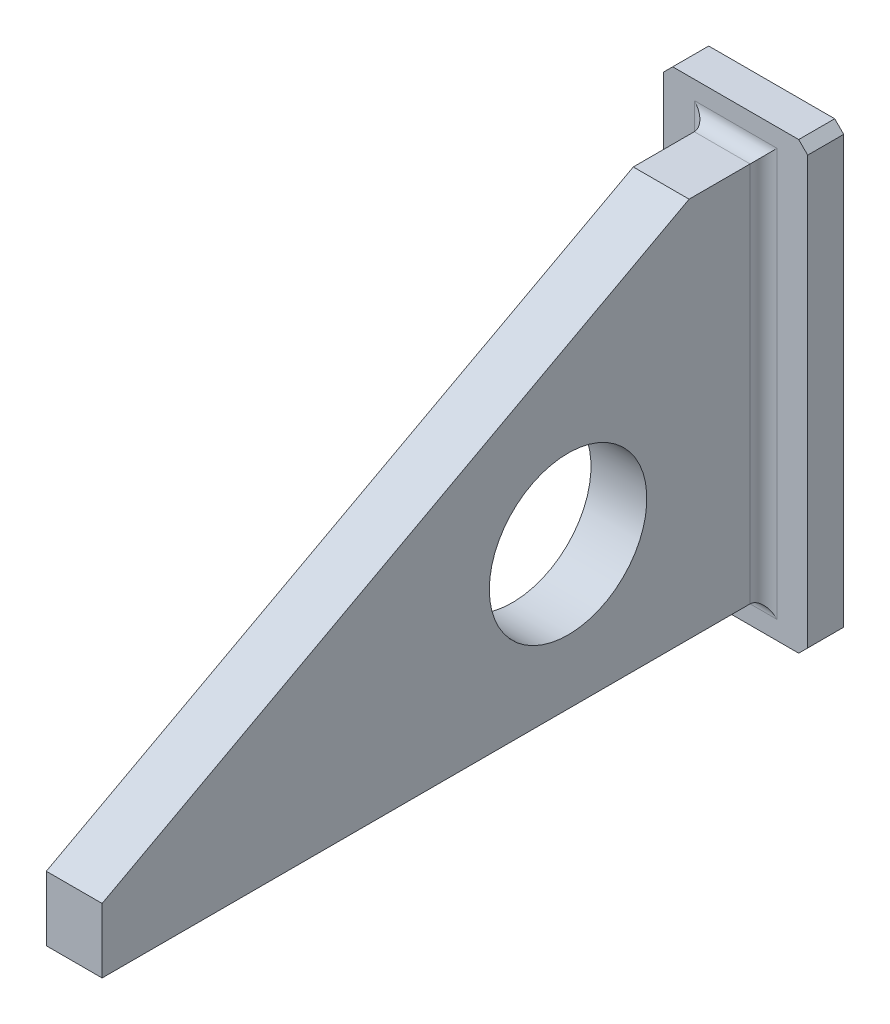
ISO-10303-21;
HEADER;
FILE_DESCRIPTION(('STEP AP214'),'2;1');
FILE_NAME('part.step','',(''),(''),'','','');
FILE_SCHEMA(('AUTOMOTIVE_DESIGN { 1 0 10303 214 1 1 1 1 }'));
ENDSEC;
DATA;
#1=APPLICATION_CONTEXT('core data for automotive mechanical design processes');
#2=APPLICATION_PROTOCOL_DEFINITION('international standard','automotive_design',2000,#1);
#3=PRODUCT_CONTEXT('',#1,'mechanical');
#4=PRODUCT('Part','Part','',(#3));
#5=PRODUCT_RELATED_PRODUCT_CATEGORY('part','',(#4));
#6=PRODUCT_DEFINITION_FORMATION('','',#4);
#7=PRODUCT_DEFINITION_CONTEXT('part definition',#1,'design');
#8=PRODUCT_DEFINITION('design','',#6,#7);
#9=PRODUCT_DEFINITION_SHAPE('','',#8);
#10=(LENGTH_UNIT() NAMED_UNIT(*) SI_UNIT(.MILLI.,.METRE.));
#11=(NAMED_UNIT(*) PLANE_ANGLE_UNIT() SI_UNIT($,.RADIAN.));
#12=(NAMED_UNIT(*) SI_UNIT($,.STERADIAN.) SOLID_ANGLE_UNIT());
#13=UNCERTAINTY_MEASURE_WITH_UNIT(LENGTH_MEASURE(1.E-05),#10,'distance_accuracy_value','');
#14=(GEOMETRIC_REPRESENTATION_CONTEXT(3) GLOBAL_UNCERTAINTY_ASSIGNED_CONTEXT((#13)) GLOBAL_UNIT_ASSIGNED_CONTEXT((#10,
#11,#12)) REPRESENTATION_CONTEXT('',''));
#15=CARTESIAN_POINT('',(0.,0.,0.));
#16=DIRECTION('',(0.,0.,1.));
#17=DIRECTION('',(1.,0.,0.));
#18=AXIS2_PLACEMENT_3D('',#15,#16,#17);
#19=CARTESIAN_POINT('',(15.748,104.974134166052,186.670645251441));
#20=DIRECTION('',(1.,0.,0.));
#21=DIRECTION('',(0.,0.,-1.));
#22=AXIS2_PLACEMENT_3D('',#19,#20,#21);
#23=PLANE('',#22);
#24=DIRECTION('',(0.,0.,-1.));
#25=VECTOR('',#24,1.);
#26=CARTESIAN_POINT('',(15.748,-2.54,186.670645251441));
#27=LINE('',#26,#25);
#28=CARTESIAN_POINT('',(15.748,-2.54,186.670645251441));
#29=VERTEX_POINT('',#28);
#30=CARTESIAN_POINT('',(15.748,-2.54,3.80999999999998));
#31=VERTEX_POINT('',#30);
#32=EDGE_CURVE('E250',#29,#31,#27,.T.);
#33=ORIENTED_EDGE('',*,*,#32,.T.);
#34=DIRECTION('',(0.,-1.,0.));
#35=VECTOR('',#34,1.);
#36=CARTESIAN_POINT('',(15.748,104.974134166052,3.81));
#37=LINE('',#36,#35);
#38=CARTESIAN_POINT('',(15.748,104.974134166052,3.81));
#39=VERTEX_POINT('',#38);
#40=EDGE_CURVE('E11',#31,#39,#37,.F.);
#41=ORIENTED_EDGE('',*,*,#40,.T.);
#42=DIRECTION('',(0.,0.,1.));
#43=VECTOR('',#42,1.);
#44=CARTESIAN_POINT('',(15.748,104.974134166052,-2.54));
#45=LINE('',#44,#43);
#46=CARTESIAN_POINT('',(15.748,104.974134166052,21.0300605139761));
#47=VERTEX_POINT('',#46);
#48=EDGE_CURVE('E135',#39,#47,#45,.T.);
#49=ORIENTED_EDGE('',*,*,#48,.T.);
#50=DIRECTION('',(0.,-0.47450986523092,0.8802501847762));
#51=VECTOR('',#50,1.);
#52=CARTESIAN_POINT('',(15.748,104.974134166052,21.0300605139761));
#53=LINE('',#52,#51);
#54=CARTESIAN_POINT('',(15.748,15.6835064560122,186.670645251441));
#55=VERTEX_POINT('',#54);
#56=EDGE_CURVE('E138',#47,#55,#53,.T.);
#57=ORIENTED_EDGE('',*,*,#56,.T.);
#58=DIRECTION('',(0.,-1.,0.));
#59=VECTOR('',#58,1.);
#60=CARTESIAN_POINT('',(15.748,15.6835064560122,186.670645251441));
#61=LINE('',#60,#59);
#62=EDGE_CURVE('E150',#55,#29,#61,.T.);
#63=ORIENTED_EDGE('',*,*,#62,.T.);
#64=EDGE_LOOP('',(#33,#41,#49,#57,#63));
#65=FACE_BOUND('',#64,.T.);
#66=CARTESIAN_POINT('',(15.748,37.768492455067,55.1806289769803));
#67=DIRECTION('',(1.,0.,0.));
#68=DIRECTION('',(0.,0.,-1.));
#69=AXIS2_PLACEMENT_3D('',#66,#67,#68);
#70=CIRCLE('',#69,22.225);
#71=CARTESIAN_POINT('',(15.748,37.768492455067,77.4056289769803));
#72=VERTEX_POINT('',#71);
#73=EDGE_CURVE('E243',#72,#72,#70,.T.);
#74=ORIENTED_EDGE('',*,*,#73,.F.);
#75=EDGE_LOOP('',(#74));
#76=FACE_BOUND('',#75,.T.);
#77=ADVANCED_FACE('F31',(#65,#76),#23,.T.);
#78=CARTESIAN_POINT('',(0.,104.974134166052,186.670645251441));
#79=DIRECTION('',(1.,0.,0.));
#80=DIRECTION('',(0.,0.,-1.));
#81=AXIS2_PLACEMENT_3D('',#78,#79,#80);
#82=PLANE('',#81);
#83=DIRECTION('',(0.,0.,1.));
#84=VECTOR('',#83,1.);
#85=CARTESIAN_POINT('',(0.,104.974134166052,-2.54));
#86=LINE('',#85,#84);
#87=CARTESIAN_POINT('',(0.,104.974134166052,3.81));
#88=VERTEX_POINT('',#87);
#89=CARTESIAN_POINT('',(0.,104.974134166052,21.0300605139761));
#90=VERTEX_POINT('',#89);
#91=EDGE_CURVE('E153',#88,#90,#86,.T.);
#92=ORIENTED_EDGE('',*,*,#91,.F.);
#93=DIRECTION('',(0.,-1.,0.));
#94=VECTOR('',#93,1.);
#95=CARTESIAN_POINT('',(0.,104.974134166052,3.81000000000001));
#96=LINE('',#95,#94);
#97=CARTESIAN_POINT('',(0.,-2.54,3.80999999999998));
#98=VERTEX_POINT('',#97);
#99=EDGE_CURVE('E208',#88,#98,#96,.T.);
#100=ORIENTED_EDGE('',*,*,#99,.T.);
#101=DIRECTION('',(0.,0.,-1.));
#102=VECTOR('',#101,1.);
#103=CARTESIAN_POINT('',(0.,-2.54,186.670645251441));
#104=LINE('',#103,#102);
#105=CARTESIAN_POINT('',(0.,-2.54,186.670645251441));
#106=VERTEX_POINT('',#105);
#107=EDGE_CURVE('E141',#106,#98,#104,.T.);
#108=ORIENTED_EDGE('',*,*,#107,.F.);
#109=DIRECTION('',(0.,-1.,0.));
#110=VECTOR('',#109,1.);
#111=CARTESIAN_POINT('',(0.,15.6835064560122,186.670645251441));
#112=LINE('',#111,#110);
#113=CARTESIAN_POINT('',(0.,15.6835064560122,186.670645251441));
#114=VERTEX_POINT('',#113);
#115=EDGE_CURVE('E255',#114,#106,#112,.T.);
#116=ORIENTED_EDGE('',*,*,#115,.F.);
#117=DIRECTION('',(0.,-0.47450986523092,0.8802501847762));
#118=VECTOR('',#117,1.);
#119=CARTESIAN_POINT('',(0.,104.974134166052,21.0300605139761));
#120=LINE('',#119,#118);
#121=EDGE_CURVE('E253',#90,#114,#120,.T.);
#122=ORIENTED_EDGE('',*,*,#121,.F.);
#123=EDGE_LOOP('',(#92,#100,#108,#116,#122));
#124=FACE_BOUND('',#123,.T.);
#125=CARTESIAN_POINT('',(0.,37.768492455067,55.1806289769803));
#126=DIRECTION('',(1.,0.,0.));
#127=DIRECTION('',(0.,0.,-1.));
#128=AXIS2_PLACEMENT_3D('',#125,#126,#127);
#129=CIRCLE('',#128,22.225);
#130=CARTESIAN_POINT('',(0.,37.768492455067,77.4056289769803));
#131=VERTEX_POINT('',#130);
#132=EDGE_CURVE('E246',#131,#131,#129,.T.);
#133=ORIENTED_EDGE('',*,*,#132,.T.);
#134=EDGE_LOOP('',(#133));
#135=FACE_BOUND('',#134,.T.);
#136=ADVANCED_FACE('F268',(#124,#135),#82,.F.);
#137=CARTESIAN_POINT('',(15.748,104.974134166052,-2.54));
#138=DIRECTION('',(0.,-1.,0.));
#139=DIRECTION('',(0.,0.,-1.));
#140=AXIS2_PLACEMENT_3D('',#137,#138,#139);
#141=PLANE('',#140);
#142=ORIENTED_EDGE('',*,*,#48,.F.);
#143=DIRECTION('',(-1.,0.,0.));
#144=VECTOR('',#143,1.);
#145=CARTESIAN_POINT('',(15.748,104.974134166052,3.81));
#146=LINE('',#145,#144);
#147=EDGE_CURVE('E40',#39,#88,#146,.T.);
#148=ORIENTED_EDGE('',*,*,#147,.T.);
#149=ORIENTED_EDGE('',*,*,#91,.T.);
#150=DIRECTION('',(-1.,0.,0.));
#151=VECTOR('',#150,1.);
#152=CARTESIAN_POINT('',(15.748,104.974134166052,21.0300605139761));
#153=LINE('',#152,#151);
#154=EDGE_CURVE('E146',#47,#90,#153,.T.);
#155=ORIENTED_EDGE('',*,*,#154,.F.);
#156=EDGE_LOOP('',(#142,#148,#149,#155));
#157=FACE_BOUND('',#156,.T.);
#158=ADVANCED_FACE('F152',(#157),#141,.F.);
#159=CARTESIAN_POINT('',(15.748,104.974134166052,21.0300605139761));
#160=DIRECTION('',(0.,-0.8802501847762,-0.47450986523092));
#161=DIRECTION('',(0.,0.47450986523092,-0.8802501847762));
#162=AXIS2_PLACEMENT_3D('',#159,#160,#161);
#163=PLANE('',#162);
#164=ORIENTED_EDGE('',*,*,#121,.T.);
#165=DIRECTION('',(-1.,0.,0.));
#166=VECTOR('',#165,1.);
#167=CARTESIAN_POINT('',(15.748,15.6835064560122,186.670645251441));
#168=LINE('',#167,#166);
#169=EDGE_CURVE('E148',#55,#114,#168,.T.);
#170=ORIENTED_EDGE('',*,*,#169,.F.);
#171=ORIENTED_EDGE('',*,*,#56,.F.);
#172=ORIENTED_EDGE('',*,*,#154,.T.);
#173=EDGE_LOOP('',(#164,#170,#171,#172));
#174=FACE_BOUND('',#173,.T.);
#175=ADVANCED_FACE('F145',(#174),#163,.F.);
#176=CARTESIAN_POINT('',(15.748,15.6835064560122,186.670645251441));
#177=DIRECTION('',(0.,0.,-1.));
#178=DIRECTION('',(-1.,0.,0.));
#179=AXIS2_PLACEMENT_3D('',#176,#177,#178);
#180=PLANE('',#179);
#181=ORIENTED_EDGE('',*,*,#115,.T.);
#182=DIRECTION('',(-1.,0.,0.));
#183=VECTOR('',#182,1.);
#184=CARTESIAN_POINT('',(15.748,-2.54,186.670645251441));
#185=LINE('',#184,#183);
#186=EDGE_CURVE('E159',#29,#106,#185,.T.);
#187=ORIENTED_EDGE('',*,*,#186,.F.);
#188=ORIENTED_EDGE('',*,*,#62,.F.);
#189=ORIENTED_EDGE('',*,*,#169,.T.);
#190=EDGE_LOOP('',(#181,#187,#188,#189));
#191=FACE_BOUND('',#190,.T.);
#192=ADVANCED_FACE('F276',(#191),#180,.F.);
#193=CARTESIAN_POINT('',(15.748,-2.54,186.670645251441));
#194=DIRECTION('',(0.,1.,0.));
#195=DIRECTION('',(0.,0.,1.));
#196=AXIS2_PLACEMENT_3D('',#193,#194,#195);
#197=PLANE('',#196);
#198=ORIENTED_EDGE('',*,*,#107,.T.);
#199=DIRECTION('',(1.,0.,0.));
#200=VECTOR('',#199,1.);
#201=CARTESIAN_POINT('',(15.748,-2.54,3.81000000000001));
#202=LINE('',#201,#200);
#203=EDGE_CURVE('E196',#98,#31,#202,.T.);
#204=ORIENTED_EDGE('',*,*,#203,.T.);
#205=ORIENTED_EDGE('',*,*,#32,.F.);
#206=ORIENTED_EDGE('',*,*,#186,.T.);
#207=EDGE_LOOP('',(#198,#204,#205,#206));
#208=FACE_BOUND('',#207,.T.);
#209=ADVANCED_FACE('F263',(#208),#197,.F.);
#210=CARTESIAN_POINT('',(15.748,37.768492455067,55.1806289769803));
#211=DIRECTION('',(-1.,0.,0.));
#212=DIRECTION('',(0.,0.,1.));
#213=AXIS2_PLACEMENT_3D('',#210,#211,#212);
#214=CYLINDRICAL_SURFACE('',#213,22.225);
#215=CARTESIAN_POINT('',(15.748,37.768492455067,77.4056289769803));
#216=CARTESIAN_POINT('',(15.5839583333333,37.768492455067,77.4056289769803));
#217=CARTESIAN_POINT('',(15.4199166666667,37.768492455067,77.4056289769803));
#218=CARTESIAN_POINT('',(15.0918333333333,37.768492455067,77.4056289769803));
#219=CARTESIAN_POINT('',(14.9277916666667,37.768492455067,77.4056289769803));
#220=CARTESIAN_POINT('',(14.5997083333333,37.768492455067,77.4056289769803));
#221=CARTESIAN_POINT('',(14.4356666666667,37.768492455067,77.4056289769803));
#222=CARTESIAN_POINT('',(14.1075833333333,37.768492455067,77.4056289769803));
#223=CARTESIAN_POINT('',(13.9435416666667,37.768492455067,77.4056289769803));
#224=CARTESIAN_POINT('',(13.6154583333333,37.768492455067,77.4056289769803));
#225=CARTESIAN_POINT('',(13.4514166666667,37.768492455067,77.4056289769803));
#226=CARTESIAN_POINT('',(13.1233333333333,37.768492455067,77.4056289769803));
#227=CARTESIAN_POINT('',(12.9592916666667,37.768492455067,77.4056289769803));
#228=CARTESIAN_POINT('',(12.6312083333333,37.768492455067,77.4056289769803));
#229=CARTESIAN_POINT('',(12.4671666666667,37.768492455067,77.4056289769803));
#230=CARTESIAN_POINT('',(12.1390833333333,37.768492455067,77.4056289769803));
#231=CARTESIAN_POINT('',(11.9750416666667,37.768492455067,77.4056289769803));
#232=CARTESIAN_POINT('',(11.6469583333333,37.768492455067,77.4056289769803));
#233=CARTESIAN_POINT('',(11.4829166666667,37.768492455067,77.4056289769803));
#234=CARTESIAN_POINT('',(11.1548333333333,37.768492455067,77.4056289769803));
#235=CARTESIAN_POINT('',(10.9907916666667,37.768492455067,77.4056289769803));
#236=CARTESIAN_POINT('',(10.6627083333333,37.768492455067,77.4056289769803));
#237=CARTESIAN_POINT('',(10.4986666666667,37.768492455067,77.4056289769803));
#238=CARTESIAN_POINT('',(10.1705833333333,37.768492455067,77.4056289769803));
#239=CARTESIAN_POINT('',(10.0065416666667,37.768492455067,77.4056289769803));
#240=CARTESIAN_POINT('',(9.67845833333332,37.768492455067,77.4056289769803));
#241=CARTESIAN_POINT('',(9.51441666666666,37.768492455067,77.4056289769803));
#242=CARTESIAN_POINT('',(9.18633333333332,37.768492455067,77.4056289769803));
#243=CARTESIAN_POINT('',(9.02229166666666,37.768492455067,77.4056289769803));
#244=CARTESIAN_POINT('',(8.69420833333333,37.768492455067,77.4056289769803));
#245=CARTESIAN_POINT('',(8.53016666666666,37.768492455067,77.4056289769803));
#246=CARTESIAN_POINT('',(8.20208333333333,37.768492455067,77.4056289769803));
#247=CARTESIAN_POINT('',(8.03804166666666,37.768492455067,77.4056289769803));
#248=CARTESIAN_POINT('',(7.70995833333333,37.768492455067,77.4056289769803));
#249=CARTESIAN_POINT('',(7.54591666666666,37.768492455067,77.4056289769803));
#250=CARTESIAN_POINT('',(7.21783333333333,37.768492455067,77.4056289769803));
#251=CARTESIAN_POINT('',(7.05379166666666,37.768492455067,77.4056289769803));
#252=CARTESIAN_POINT('',(6.72570833333333,37.768492455067,77.4056289769803));
#253=CARTESIAN_POINT('',(6.56166666666666,37.768492455067,77.4056289769803));
#254=CARTESIAN_POINT('',(6.23358333333333,37.768492455067,77.4056289769803));
#255=CARTESIAN_POINT('',(6.06954166666666,37.768492455067,77.4056289769803));
#256=CARTESIAN_POINT('',(5.74145833333333,37.768492455067,77.4056289769803));
#257=CARTESIAN_POINT('',(5.57741666666666,37.768492455067,77.4056289769803));
#258=CARTESIAN_POINT('',(5.24933333333333,37.768492455067,77.4056289769803));
#259=CARTESIAN_POINT('',(5.08529166666666,37.768492455067,77.4056289769803));
#260=CARTESIAN_POINT('',(4.75720833333333,37.768492455067,77.4056289769803));
#261=CARTESIAN_POINT('',(4.59316666666666,37.768492455067,77.4056289769803));
#262=CARTESIAN_POINT('',(4.26508333333333,37.768492455067,77.4056289769803));
#263=CARTESIAN_POINT('',(4.10104166666666,37.768492455067,77.4056289769803));
#264=CARTESIAN_POINT('',(3.77295833333333,37.768492455067,77.4056289769803));
#265=CARTESIAN_POINT('',(3.60891666666666,37.768492455067,77.4056289769803));
#266=CARTESIAN_POINT('',(3.28083333333333,37.768492455067,77.4056289769803));
#267=CARTESIAN_POINT('',(3.11679166666666,37.768492455067,77.4056289769803));
#268=CARTESIAN_POINT('',(2.78870833333333,37.768492455067,77.4056289769803));
#269=CARTESIAN_POINT('',(2.62466666666666,37.768492455067,77.4056289769803));
#270=CARTESIAN_POINT('',(2.29658333333333,37.768492455067,77.4056289769803));
#271=CARTESIAN_POINT('',(2.13254166666666,37.768492455067,77.4056289769803));
#272=CARTESIAN_POINT('',(1.80445833333333,37.768492455067,77.4056289769803));
#273=CARTESIAN_POINT('',(1.64041666666667,37.768492455067,77.4056289769803));
#274=CARTESIAN_POINT('',(1.31233333333333,37.768492455067,77.4056289769803));
#275=CARTESIAN_POINT('',(1.14829166666667,37.768492455067,77.4056289769803));
#276=CARTESIAN_POINT('',(0.820208333333333,37.768492455067,77.4056289769803));
#277=CARTESIAN_POINT('',(0.656166666666666,37.768492455067,77.4056289769803));
#278=CARTESIAN_POINT('',(0.328083333333333,37.768492455067,77.4056289769803));
#279=CARTESIAN_POINT('',(0.164041666666666,37.768492455067,77.4056289769803));
#280=CARTESIAN_POINT('',(0.,37.768492455067,77.4056289769803));
#281=B_SPLINE_CURVE_WITH_KNOTS('',3,(#215,#216,#217,#218,#219,#220,#221,#222,#223,#224,#225,
#226,#227,#228,#229,#230,#231,#232,#233,#234,#235,#236,#237,#238,#239,#240,#241,#242,#243,#244,
#245,#246,#247,#248,#249,#250,#251,#252,#253,#254,#255,#256,#257,#258,#259,#260,#261,#262,#263,
#264,#265,#266,#267,#268,#269,#270,#271,#272,#273,#274,#275,#276,#277,#278,#279,#280),
.UNSPECIFIED.,.F.,.F.,(4,2,2,2,2,2,2,2,2,2,2,2,2,2,2,2,2,2,2,2,2,2,2,2,2,2,2,2,2,2,2,2,4),(0.,
0.492124999999998,0.984249999999997,1.476375,1.9685,2.460625,2.95275,3.44487499999999,
3.93699999999999,4.42912499999999,4.92124999999999,5.41337499999999,5.90549999999999,
6.39762499999999,6.88974999999999,7.38187499999999,7.87399999999999,8.36612499999999,
8.85824999999999,9.35037499999999,9.84249999999999,10.334625,10.82675,11.318875,11.811,
12.303125,12.79525,13.287375,13.7795,14.271625,14.76375,15.255875,15.748),.UNSPECIFIED.);
#282=EDGE_CURVE('BSEAM283',#72,#131,#281,.T.);
#283=ORIENTED_EDGE('',*,*,#73,.T.);
#284=ORIENTED_EDGE('',*,*,#132,.F.);
#285=ORIENTED_EDGE('',*,*,#282,.T.);
#286=ORIENTED_EDGE('',*,*,#282,.F.);
#287=EDGE_LOOP('',(#283,#285,#284,#286));
#288=FACE_BOUND('',#287,.T.);
#289=ADVANCED_FACE('F283',(#288),#214,.F.);
#290=CARTESIAN_POINT('',(28.189793123169,-11.5508655345111,0.));
#291=DIRECTION('',(0.,0.,1.));
#292=DIRECTION('',(1.,0.,0.));
#293=AXIS2_PLACEMENT_3D('',#290,#291,#292);
#294=PLANE('',#293);
#295=DIRECTION('',(0.,-1.,0.));
#296=VECTOR('',#295,1.);
#297=CARTESIAN_POINT('',(19.558,-2.54,0.));
#298=LINE('',#297,#296);
#299=CARTESIAN_POINT('',(19.558,108.784134166052,0.));
#300=VERTEX_POINT('',#299);
#301=CARTESIAN_POINT('',(19.558,-6.35,0.));
#302=VERTEX_POINT('',#301);
#303=EDGE_CURVE('E199',#300,#302,#298,.T.);
#304=ORIENTED_EDGE('',*,*,#303,.T.);
#305=DIRECTION('',(1.,0.,0.));
#306=VECTOR('',#305,1.);
#307=CARTESIAN_POINT('',(28.189793123169,-6.35,0.));
#308=LINE('',#307,#306);
#309=CARTESIAN_POINT('',(-3.81,-6.35,0.));
#310=VERTEX_POINT('',#309);
#311=EDGE_CURVE('E205',#302,#310,#308,.F.);
#312=ORIENTED_EDGE('',*,*,#311,.T.);
#313=DIRECTION('',(0.,-1.,0.));
#314=VECTOR('',#313,1.);
#315=CARTESIAN_POINT('',(-3.81,-11.5508655345111,0.));
#316=LINE('',#315,#314);
#317=CARTESIAN_POINT('',(-3.81,108.784134166052,0.));
#318=VERTEX_POINT('',#317);
#319=EDGE_CURVE('E203',#310,#318,#316,.F.);
#320=ORIENTED_EDGE('',*,*,#319,.T.);
#321=DIRECTION('',(-1.,0.,0.));
#322=VECTOR('',#321,1.);
#323=CARTESIAN_POINT('',(28.189793123169,108.784134166052,0.));
#324=LINE('',#323,#322);
#325=EDGE_CURVE('E201',#318,#300,#324,.F.);
#326=ORIENTED_EDGE('',*,*,#325,.T.);
#327=EDGE_LOOP('',(#304,#312,#320,#326));
#328=FACE_BOUND('',#327,.T.);
#329=DIRECTION('',(1.,0.,0.));
#330=VECTOR('',#329,1.);
#331=CARTESIAN_POINT('',(-12.441793123169,-11.5508655345111,0.));
#332=LINE('',#331,#330);
#333=CARTESIAN_POINT('',(-9.90179312316899,-11.5508655345111,0.));
#334=VERTEX_POINT('',#333);
#335=CARTESIAN_POINT('',(25.649793123169,-11.5508655345111,0.));
#336=VERTEX_POINT('',#335);
#337=EDGE_CURVE('E239',#334,#336,#332,.T.);
#338=ORIENTED_EDGE('',*,*,#337,.T.);
#339=DIRECTION('',(-0.707106781186543,-0.707106781186552,0.));
#340=VECTOR('',#339,1.);
#341=CARTESIAN_POINT('',(26.919793123169,-10.2808655345111,0.));
#342=LINE('',#341,#340);
#343=CARTESIAN_POINT('',(28.189793123169,-9.01086553451114,0.));
#344=VERTEX_POINT('',#343);
#345=EDGE_CURVE('E171',#336,#344,#342,.F.);
#346=ORIENTED_EDGE('',*,*,#345,.T.);
#347=DIRECTION('',(0.,1.,0.));
#348=VECTOR('',#347,1.);
#349=CARTESIAN_POINT('',(28.189793123169,113.984999700563,0.));
#350=LINE('',#349,#348);
#351=CARTESIAN_POINT('',(28.189793123169,111.444999700563,0.));
#352=VERTEX_POINT('',#351);
#353=EDGE_CURVE('E220',#344,#352,#350,.T.);
#354=ORIENTED_EDGE('',*,*,#353,.T.);
#355=DIRECTION('',(0.707106781186551,-0.707106781186544,0.));
#356=VECTOR('',#355,1.);
#357=CARTESIAN_POINT('',(89.6877257407061,49.9470670830267,0.));
#358=LINE('',#357,#356);
#359=CARTESIAN_POINT('',(25.6497931231689,113.984999700563,0.));
#360=VERTEX_POINT('',#359);
#361=EDGE_CURVE('E165',#352,#360,#358,.F.);
#362=ORIENTED_EDGE('',*,*,#361,.T.);
#363=DIRECTION('',(-1.,0.,0.));
#364=VECTOR('',#363,1.);
#365=CARTESIAN_POINT('',(-12.441793123169,113.984999700563,0.));
#366=LINE('',#365,#364);
#367=CARTESIAN_POINT('',(-9.90179312316895,113.984999700563,0.));
#368=VERTEX_POINT('',#367);
#369=EDGE_CURVE('E226',#360,#368,#366,.T.);
#370=ORIENTED_EDGE('',*,*,#369,.T.);
#371=DIRECTION('',(0.707106781186548,0.707106781186548,0.));
#372=VECTOR('',#371,1.);
#373=CARTESIAN_POINT('',(-53.6239326175372,70.262860206195,0.));
#374=LINE('',#373,#372);
#375=CARTESIAN_POINT('',(-12.441793123169,111.444999700563,0.));
#376=VERTEX_POINT('',#375);
#377=EDGE_CURVE('E167',#368,#376,#374,.F.);
#378=ORIENTED_EDGE('',*,*,#377,.T.);
#379=DIRECTION('',(0.,-1.,0.));
#380=VECTOR('',#379,1.);
#381=CARTESIAN_POINT('',(-12.441793123169,113.984999700563,0.));
#382=LINE('',#381,#380);
#383=CARTESIAN_POINT('',(-12.441793123169,-9.01086553451113,0.));
#384=VERTEX_POINT('',#383);
#385=EDGE_CURVE('E231',#376,#384,#382,.T.);
#386=ORIENTED_EDGE('',*,*,#385,.T.);
#387=DIRECTION('',(-0.707106781186547,0.707106781186548,0.));
#388=VECTOR('',#387,1.);
#389=CARTESIAN_POINT('',(9.14399999999996,-30.5966586576801,0.));
#390=LINE('',#389,#388);
#391=EDGE_CURVE('E169',#384,#334,#390,.F.);
#392=ORIENTED_EDGE('',*,*,#391,.T.);
#393=EDGE_LOOP('',(#338,#346,#354,#362,#370,#378,#386,#392));
#394=FACE_BOUND('',#393,.T.);
#395=ADVANCED_FACE('F295',(#328,#394),#294,.T.);
#396=CARTESIAN_POINT('',(28.189793123169,113.984999700563,-10.16));
#397=DIRECTION('',(1.,0.,0.));
#398=DIRECTION('',(0.,0.,-1.));
#399=AXIS2_PLACEMENT_3D('',#396,#397,#398);
#400=PLANE('',#399);
#401=ORIENTED_EDGE('',*,*,#353,.F.);
#402=DIRECTION('',(0.,0.,-1.));
#403=VECTOR('',#402,1.);
#404=CARTESIAN_POINT('',(28.189793123169,-9.01086553451114,-10.16));
#405=LINE('',#404,#403);
#406=CARTESIAN_POINT('',(28.189793123169,-9.01086553451114,-10.16));
#407=VERTEX_POINT('',#406);
#408=EDGE_CURVE('E176',#344,#407,#405,.T.);
#409=ORIENTED_EDGE('',*,*,#408,.T.);
#410=DIRECTION('',(0.,1.,0.));
#411=VECTOR('',#410,1.);
#412=CARTESIAN_POINT('',(28.189793123169,113.984999700563,-10.16));
#413=LINE('',#412,#411);
#414=CARTESIAN_POINT('',(28.189793123169,111.444999700563,-10.16));
#415=VERTEX_POINT('',#414);
#416=EDGE_CURVE('E242',#407,#415,#413,.T.);
#417=ORIENTED_EDGE('',*,*,#416,.T.);
#418=DIRECTION('',(0.,0.,1.));
#419=VECTOR('',#418,1.);
#420=CARTESIAN_POINT('',(28.189793123169,111.444999700563,-10.16));
#421=LINE('',#420,#419);
#422=EDGE_CURVE('E173',#415,#352,#421,.T.);
#423=ORIENTED_EDGE('',*,*,#422,.T.);
#424=EDGE_LOOP('',(#401,#409,#417,#423));
#425=FACE_BOUND('',#424,.T.);
#426=ADVANCED_FACE('F297',(#425),#400,.T.);
#427=CARTESIAN_POINT('',(-12.441793123169,-11.5508655345111,-10.16));
#428=DIRECTION('',(0.,-1.,0.));
#429=DIRECTION('',(0.,0.,-1.));
#430=AXIS2_PLACEMENT_3D('',#427,#428,#429);
#431=PLANE('',#430);
#432=DIRECTION('',(1.,0.,0.));
#433=VECTOR('',#432,1.);
#434=CARTESIAN_POINT('',(-12.441793123169,-11.5508655345111,-10.16));
#435=LINE('',#434,#433);
#436=CARTESIAN_POINT('',(-9.90179312316899,-11.5508655345111,-10.16));
#437=VERTEX_POINT('',#436);
#438=CARTESIAN_POINT('',(25.649793123169,-11.5508655345111,-10.16));
#439=VERTEX_POINT('',#438);
#440=EDGE_CURVE('E234',#437,#439,#435,.T.);
#441=ORIENTED_EDGE('',*,*,#440,.T.);
#442=DIRECTION('',(0.,0.,1.));
#443=VECTOR('',#442,1.);
#444=CARTESIAN_POINT('',(25.649793123169,-11.5508655345111,-10.16));
#445=LINE('',#444,#443);
#446=EDGE_CURVE('E157',#439,#336,#445,.T.);
#447=ORIENTED_EDGE('',*,*,#446,.T.);
#448=ORIENTED_EDGE('',*,*,#337,.F.);
#449=DIRECTION('',(0.,0.,-1.));
#450=VECTOR('',#449,1.);
#451=CARTESIAN_POINT('',(-9.90179312316899,-11.5508655345111,-10.16));
#452=LINE('',#451,#450);
#453=EDGE_CURVE('E155',#334,#437,#452,.T.);
#454=ORIENTED_EDGE('',*,*,#453,.T.);
#455=EDGE_LOOP('',(#441,#447,#448,#454));
#456=FACE_BOUND('',#455,.T.);
#457=ADVANCED_FACE('F300',(#456),#431,.T.);
#458=CARTESIAN_POINT('',(-12.441793123169,113.984999700563,-10.16));
#459=DIRECTION('',(-1.,0.,0.));
#460=DIRECTION('',(0.,0.,1.));
#461=AXIS2_PLACEMENT_3D('',#458,#459,#460);
#462=PLANE('',#461);
#463=DIRECTION('',(0.,-1.,0.));
#464=VECTOR('',#463,1.);
#465=CARTESIAN_POINT('',(-12.441793123169,113.984999700563,-10.16));
#466=LINE('',#465,#464);
#467=CARTESIAN_POINT('',(-12.441793123169,111.444999700563,-10.16));
#468=VERTEX_POINT('',#467);
#469=CARTESIAN_POINT('',(-12.441793123169,-9.01086553451115,-10.16));
#470=VERTEX_POINT('',#469);
#471=EDGE_CURVE('E347',#468,#470,#466,.T.);
#472=ORIENTED_EDGE('',*,*,#471,.T.);
#473=DIRECTION('',(0.,0.,1.));
#474=VECTOR('',#473,1.);
#475=CARTESIAN_POINT('',(-12.441793123169,-9.01086553451114,-10.16));
#476=LINE('',#475,#474);
#477=EDGE_CURVE('E188',#470,#384,#476,.T.);
#478=ORIENTED_EDGE('',*,*,#477,.T.);
#479=ORIENTED_EDGE('',*,*,#385,.F.);
#480=DIRECTION('',(0.,0.,-1.));
#481=VECTOR('',#480,1.);
#482=CARTESIAN_POINT('',(-12.441793123169,111.444999700563,-10.16));
#483=LINE('',#482,#481);
#484=EDGE_CURVE('E186',#376,#468,#483,.T.);
#485=ORIENTED_EDGE('',*,*,#484,.T.);
#486=EDGE_LOOP('',(#472,#478,#479,#485));
#487=FACE_BOUND('',#486,.T.);
#488=ADVANCED_FACE('F306',(#487),#462,.T.);
#489=CARTESIAN_POINT('',(-12.441793123169,113.984999700563,-10.16));
#490=DIRECTION('',(0.,1.,0.));
#491=DIRECTION('',(0.,0.,1.));
#492=AXIS2_PLACEMENT_3D('',#489,#490,#491);
#493=PLANE('',#492);
#494=DIRECTION('',(-1.,0.,0.));
#495=VECTOR('',#494,1.);
#496=CARTESIAN_POINT('',(-12.441793123169,113.984999700563,-10.16));
#497=LINE('',#496,#495);
#498=CARTESIAN_POINT('',(25.6497931231689,113.984999700563,-10.16));
#499=VERTEX_POINT('',#498);
#500=CARTESIAN_POINT('',(-9.90179312316899,113.984999700563,-10.16));
#501=VERTEX_POINT('',#500);
#502=EDGE_CURVE('E334',#499,#501,#497,.T.);
#503=ORIENTED_EDGE('',*,*,#502,.T.);
#504=DIRECTION('',(0.,0.,1.));
#505=VECTOR('',#504,1.);
#506=CARTESIAN_POINT('',(-9.90179312316899,113.984999700563,-10.16));
#507=LINE('',#506,#505);
#508=EDGE_CURVE('E193',#501,#368,#507,.T.);
#509=ORIENTED_EDGE('',*,*,#508,.T.);
#510=ORIENTED_EDGE('',*,*,#369,.F.);
#511=DIRECTION('',(0.,0.,-1.));
#512=VECTOR('',#511,1.);
#513=CARTESIAN_POINT('',(25.6497931231689,113.984999700563,-10.16));
#514=LINE('',#513,#512);
#515=EDGE_CURVE('E191',#360,#499,#514,.T.);
#516=ORIENTED_EDGE('',*,*,#515,.T.);
#517=EDGE_LOOP('',(#503,#509,#510,#516));
#518=FACE_BOUND('',#517,.T.);
#519=ADVANCED_FACE('F302',(#518),#493,.T.);
#520=CARTESIAN_POINT('',(28.189793123169,-11.5508655345111,-10.16));
#521=DIRECTION('',(0.,0.,1.));
#522=DIRECTION('',(1.,0.,0.));
#523=AXIS2_PLACEMENT_3D('',#520,#521,#522);
#524=PLANE('',#523);
#525=ORIENTED_EDGE('',*,*,#416,.F.);
#526=DIRECTION('',(0.707106781186543,0.707106781186552,0.));
#527=VECTOR('',#526,1.);
#528=CARTESIAN_POINT('',(25.649793123169,-11.5508655345111,-10.16));
#529=LINE('',#528,#527);
#530=EDGE_CURVE('E184',#407,#439,#529,.F.);
#531=ORIENTED_EDGE('',*,*,#530,.T.);
#532=ORIENTED_EDGE('',*,*,#440,.F.);
#533=DIRECTION('',(0.707106781186547,-0.707106781186548,0.));
#534=VECTOR('',#533,1.);
#535=CARTESIAN_POINT('',(-12.441793123169,-9.01086553451114,-10.16));
#536=LINE('',#535,#534);
#537=EDGE_CURVE('E182',#437,#470,#536,.F.);
#538=ORIENTED_EDGE('',*,*,#537,.T.);
#539=ORIENTED_EDGE('',*,*,#471,.F.);
#540=DIRECTION('',(-0.707106781186548,-0.707106781186548,0.));
#541=VECTOR('',#540,1.);
#542=CARTESIAN_POINT('',(-9.90179312316899,113.984999700563,-10.16));
#543=LINE('',#542,#541);
#544=EDGE_CURVE('E180',#468,#501,#543,.F.);
#545=ORIENTED_EDGE('',*,*,#544,.T.);
#546=ORIENTED_EDGE('',*,*,#502,.F.);
#547=DIRECTION('',(-0.707106781186551,0.707106781186544,0.));
#548=VECTOR('',#547,1.);
#549=CARTESIAN_POINT('',(28.189793123169,111.444999700563,-10.16));
#550=LINE('',#549,#548);
#551=EDGE_CURVE('E178',#499,#415,#550,.F.);
#552=ORIENTED_EDGE('',*,*,#551,.T.);
#553=EDGE_LOOP('',(#525,#531,#532,#538,#539,#545,#546,#552));
#554=FACE_BOUND('',#553,.T.);
#555=ADVANCED_FACE('F305',(#554),#524,.F.);
#556=CARTESIAN_POINT('',(25.649793123169,-11.5508655345111,-10.16));
#557=DIRECTION('',(-0.707106781186552,0.707106781186543,0.));
#558=DIRECTION('',(-0.707106781186543,-0.707106781186552,0.));
#559=AXIS2_PLACEMENT_3D('',#556,#557,#558);
#560=PLANE('',#559);
#561=ORIENTED_EDGE('',*,*,#530,.F.);
#562=ORIENTED_EDGE('',*,*,#408,.F.);
#563=ORIENTED_EDGE('',*,*,#345,.F.);
#564=ORIENTED_EDGE('',*,*,#446,.F.);
#565=EDGE_LOOP('',(#561,#562,#563,#564));
#566=FACE_BOUND('',#565,.T.);
#567=ADVANCED_FACE('F318',(#566),#560,.F.);
#568=CARTESIAN_POINT('',(-12.441793123169,-9.01086553451114,-10.16));
#569=DIRECTION('',(0.707106781186548,0.707106781186547,0.));
#570=DIRECTION('',(-0.707106781186547,0.707106781186548,0.));
#571=AXIS2_PLACEMENT_3D('',#568,#569,#570);
#572=PLANE('',#571);
#573=ORIENTED_EDGE('',*,*,#537,.F.);
#574=ORIENTED_EDGE('',*,*,#453,.F.);
#575=ORIENTED_EDGE('',*,*,#391,.F.);
#576=ORIENTED_EDGE('',*,*,#477,.F.);
#577=EDGE_LOOP('',(#573,#574,#575,#576));
#578=FACE_BOUND('',#577,.T.);
#579=ADVANCED_FACE('F323',(#578),#572,.F.);
#580=CARTESIAN_POINT('',(-9.90179312316899,113.984999700563,-10.16));
#581=DIRECTION('',(0.707106781186548,-0.707106781186548,0.));
#582=DIRECTION('',(0.707106781186548,0.707106781186548,0.));
#583=AXIS2_PLACEMENT_3D('',#580,#581,#582);
#584=PLANE('',#583);
#585=ORIENTED_EDGE('',*,*,#544,.F.);
#586=ORIENTED_EDGE('',*,*,#484,.F.);
#587=ORIENTED_EDGE('',*,*,#377,.F.);
#588=ORIENTED_EDGE('',*,*,#508,.F.);
#589=EDGE_LOOP('',(#585,#586,#587,#588));
#590=FACE_BOUND('',#589,.T.);
#591=ADVANCED_FACE('F355',(#590),#584,.F.);
#592=CARTESIAN_POINT('',(28.189793123169,111.444999700563,-10.16));
#593=DIRECTION('',(-0.707106781186544,-0.707106781186551,0.));
#594=DIRECTION('',(0.707106781186551,-0.707106781186544,0.));
#595=AXIS2_PLACEMENT_3D('',#592,#593,#594);
#596=PLANE('',#595);
#597=ORIENTED_EDGE('',*,*,#551,.F.);
#598=ORIENTED_EDGE('',*,*,#515,.F.);
#599=ORIENTED_EDGE('',*,*,#361,.F.);
#600=ORIENTED_EDGE('',*,*,#422,.F.);
#601=EDGE_LOOP('',(#597,#598,#599,#600));
#602=FACE_BOUND('',#601,.T.);
#603=ADVANCED_FACE('F357',(#602),#596,.F.);
#604=CARTESIAN_POINT('',(15.748,108.784134166052,3.81));
#605=DIRECTION('',(-1.,0.,0.));
#606=DIRECTION('',(0.,0.,1.));
#607=AXIS2_PLACEMENT_3D('',#604,#605,#606);
#608=CYLINDRICAL_SURFACE('',#607,3.81);
#609=CARTESIAN_POINT('',(19.558,108.784134166052,3.81));
#610=DIRECTION('',(-0.707106781186547,0.707106781186547,0.));
#611=DIRECTION('',(0.707106781186547,0.707106781186547,0.));
#612=AXIS2_PLACEMENT_3D('',#609,#610,#611);
#613=ELLIPSE('',#612,5.38815367264149,3.81);
#614=EDGE_CURVE('E214',#300,#39,#613,.T.);
#615=ORIENTED_EDGE('',*,*,#614,.F.);
#616=ORIENTED_EDGE('',*,*,#325,.F.);
#617=CARTESIAN_POINT('',(-3.81,108.784134166052,3.81));
#618=DIRECTION('',(-0.707106781186547,-0.707106781186547,0.));
#619=DIRECTION('',(-0.707106781186547,0.707106781186547,0.));
#620=AXIS2_PLACEMENT_3D('',#617,#618,#619);
#621=ELLIPSE('',#620,5.38815367264149,3.81);
#622=EDGE_CURVE('E35',#88,#318,#621,.F.);
#623=ORIENTED_EDGE('',*,*,#622,.F.);
#624=ORIENTED_EDGE('',*,*,#147,.F.);
#625=EDGE_LOOP('',(#615,#616,#623,#624));
#626=FACE_BOUND('',#625,.T.);
#627=ADVANCED_FACE('F33',(#626),#608,.F.);
#628=CARTESIAN_POINT('',(-3.81,104.974134166052,3.81000000000001));
#629=DIRECTION('',(0.,-1.,0.));
#630=DIRECTION('',(0.,0.,-1.));
#631=AXIS2_PLACEMENT_3D('',#628,#629,#630);
#632=CYLINDRICAL_SURFACE('',#631,3.81);
#633=ORIENTED_EDGE('',*,*,#622,.T.);
#634=ORIENTED_EDGE('',*,*,#319,.F.);
#635=CARTESIAN_POINT('',(-3.81,-6.35,3.81000000000001));
#636=DIRECTION('',(0.707106781186547,-0.707106781186547,0.));
#637=DIRECTION('',(-0.707106781186547,-0.707106781186547,0.));
#638=AXIS2_PLACEMENT_3D('',#635,#636,#637);
#639=ELLIPSE('',#638,5.38815367264149,3.81);
#640=EDGE_CURVE('E213',#98,#310,#639,.F.);
#641=ORIENTED_EDGE('',*,*,#640,.F.);
#642=ORIENTED_EDGE('',*,*,#99,.F.);
#643=EDGE_LOOP('',(#633,#634,#641,#642));
#644=FACE_BOUND('',#643,.T.);
#645=ADVANCED_FACE('F270',(#644),#632,.F.);
#646=CARTESIAN_POINT('',(19.558,-11.5508655345111,3.81));
#647=DIRECTION('',(0.,1.,0.));
#648=DIRECTION('',(0.,0.,1.));
#649=AXIS2_PLACEMENT_3D('',#646,#647,#648);
#650=CYLINDRICAL_SURFACE('',#649,3.81);
#651=ORIENTED_EDGE('',*,*,#614,.T.);
#652=ORIENTED_EDGE('',*,*,#40,.F.);
#653=CARTESIAN_POINT('',(19.558,-6.35,3.81));
#654=DIRECTION('',(0.707106781186547,0.707106781186547,0.));
#655=DIRECTION('',(-0.707106781186547,0.707106781186547,0.));
#656=AXIS2_PLACEMENT_3D('',#653,#654,#655);
#657=ELLIPSE('',#656,5.38815367264149,3.81);
#658=EDGE_CURVE('E211',#302,#31,#657,.T.);
#659=ORIENTED_EDGE('',*,*,#658,.F.);
#660=ORIENTED_EDGE('',*,*,#303,.F.);
#661=EDGE_LOOP('',(#651,#652,#659,#660));
#662=FACE_BOUND('',#661,.T.);
#663=ADVANCED_FACE('F370',(#662),#650,.F.);
#664=CARTESIAN_POINT('',(15.748,-6.35,3.81000000000001));
#665=DIRECTION('',(1.,0.,0.));
#666=DIRECTION('',(0.,0.,-1.));
#667=AXIS2_PLACEMENT_3D('',#664,#665,#666);
#668=CYLINDRICAL_SURFACE('',#667,3.81);
#669=ORIENTED_EDGE('',*,*,#640,.T.);
#670=ORIENTED_EDGE('',*,*,#311,.F.);
#671=ORIENTED_EDGE('',*,*,#658,.T.);
#672=ORIENTED_EDGE('',*,*,#203,.F.);
#673=EDGE_LOOP('',(#669,#670,#671,#672));
#674=FACE_BOUND('',#673,.T.);
#675=ADVANCED_FACE('F274',(#674),#668,.F.);
#676=CLOSED_SHELL('',(#77,#136,#158,#175,#192,#209,#289,#395,#426,#457,#488,#519,#555,#567,#579,
#591,#603,#627,#645,#663,#675));
#677=MANIFOLD_SOLID_BREP('B2',#676);
#678=ADVANCED_BREP_SHAPE_REPRESENTATION('',(#18,#677),#14);
#679=SHAPE_DEFINITION_REPRESENTATION(#9,#678);
ENDSEC;
END-ISO-10303-21;
